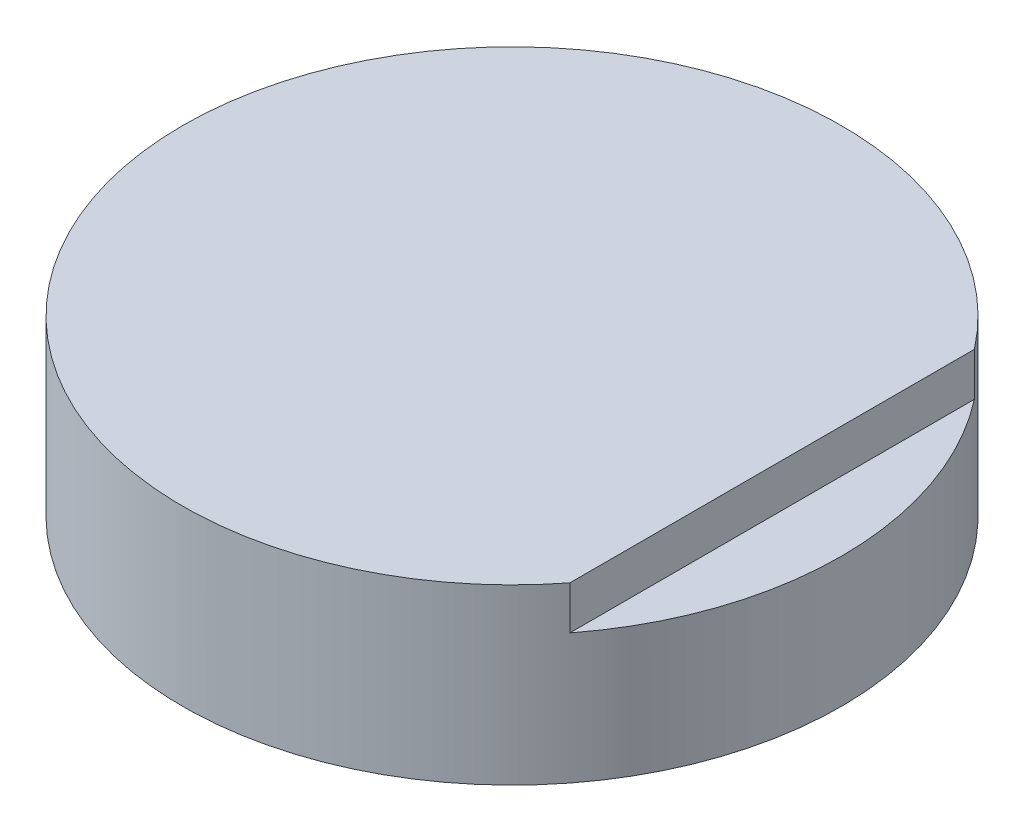
ISO-10303-21;
HEADER;
FILE_DESCRIPTION(('STEP AP214'),'2;1');
FILE_NAME('part.step','',(''),(''),'','','');
FILE_SCHEMA(('AUTOMOTIVE_DESIGN { 1 0 10303 214 1 1 1 1 }'));
ENDSEC;
DATA;
#1=APPLICATION_CONTEXT('core data for automotive mechanical design processes');
#2=APPLICATION_PROTOCOL_DEFINITION('international standard','automotive_design',2000,#1);
#3=PRODUCT_CONTEXT('',#1,'mechanical');
#4=PRODUCT('Part','Part','',(#3));
#5=PRODUCT_RELATED_PRODUCT_CATEGORY('part','',(#4));
#6=PRODUCT_DEFINITION_FORMATION('','',#4);
#7=PRODUCT_DEFINITION_CONTEXT('part definition',#1,'design');
#8=PRODUCT_DEFINITION('design','',#6,#7);
#9=PRODUCT_DEFINITION_SHAPE('','',#8);
#10=(LENGTH_UNIT() NAMED_UNIT(*) SI_UNIT(.MILLI.,.METRE.));
#11=(NAMED_UNIT(*) PLANE_ANGLE_UNIT() SI_UNIT($,.RADIAN.));
#12=(NAMED_UNIT(*) SI_UNIT($,.STERADIAN.) SOLID_ANGLE_UNIT());
#13=UNCERTAINTY_MEASURE_WITH_UNIT(LENGTH_MEASURE(1.E-05),#10,'distance_accuracy_value','');
#14=(GEOMETRIC_REPRESENTATION_CONTEXT(3) GLOBAL_UNCERTAINTY_ASSIGNED_CONTEXT((#13)) GLOBAL_UNIT_ASSIGNED_CONTEXT((#10,
#11,#12)) REPRESENTATION_CONTEXT('',''));
#15=CARTESIAN_POINT('',(0.,0.,0.));
#16=DIRECTION('',(0.,0.,1.));
#17=DIRECTION('',(1.,0.,0.));
#18=AXIS2_PLACEMENT_3D('',#15,#16,#17);
#19=CARTESIAN_POINT('',(-26.2916512459885,-69.5,0.));
#20=DIRECTION('',(0.,1.,0.));
#21=DIRECTION('',(0.,0.,1.));
#22=AXIS2_PLACEMENT_3D('',#19,#20,#21);
#23=CYLINDRICAL_SURFACE('',#22,3.8);
#24=CARTESIAN_POINT('',(-26.2916512459885,-69.,0.));
#25=DIRECTION('',(0.,-1.,0.));
#26=DIRECTION('',(0.,0.,-1.));
#27=AXIS2_PLACEMENT_3D('',#24,#25,#26);
#28=CIRCLE('',#27,3.8);
#29=CARTESIAN_POINT('',(-23.2916512459885,-69.,2.33238075793812));
#30=VERTEX_POINT('',#29);
#31=CARTESIAN_POINT('',(-23.2916512459885,-69.,-2.33238075793812));
#32=VERTEX_POINT('',#31);
#33=EDGE_CURVE('E82',#30,#32,#28,.T.);
#34=ORIENTED_EDGE('',*,*,#33,.T.);
#35=DIRECTION('',(0.,1.,0.));
#36=VECTOR('',#35,1.);
#37=CARTESIAN_POINT('',(-23.2916512459885,-69.5,-2.33238075793812));
#38=LINE('',#37,#36);
#39=CARTESIAN_POINT('',(-23.2916512459885,-69.5,-2.33238075793812));
#40=VERTEX_POINT('',#39);
#41=EDGE_CURVE('E11',#40,#32,#38,.T.);
#42=ORIENTED_EDGE('',*,*,#41,.F.);
#43=CARTESIAN_POINT('',(-26.2916512459885,-69.5,0.));
#44=DIRECTION('',(0.,-1.,0.));
#45=DIRECTION('',(0.,0.,-1.));
#46=AXIS2_PLACEMENT_3D('',#43,#44,#45);
#47=CIRCLE('',#46,3.8);
#48=CARTESIAN_POINT('',(-23.2916512459885,-69.5,2.33238075793812));
#49=VERTEX_POINT('',#48);
#50=EDGE_CURVE('E73',#40,#49,#47,.T.);
#51=ORIENTED_EDGE('',*,*,#50,.T.);
#52=DIRECTION('',(0.,1.,0.));
#53=VECTOR('',#52,1.);
#54=CARTESIAN_POINT('',(-23.2916512459885,-69.5,2.33238075793812));
#55=LINE('',#54,#53);
#56=EDGE_CURVE('E49',#49,#30,#55,.T.);
#57=ORIENTED_EDGE('',*,*,#56,.T.);
#58=EDGE_LOOP('',(#34,#42,#51,#57));
#59=FACE_BOUND('',#58,.T.);
#60=CARTESIAN_POINT('',(-26.2916512459885,-71.,0.));
#61=DIRECTION('',(0.,-1.,0.));
#62=DIRECTION('',(0.,0.,-1.));
#63=AXIS2_PLACEMENT_3D('',#60,#61,#62);
#64=CIRCLE('',#63,3.8);
#65=CARTESIAN_POINT('',(-26.2916512459885,-71.,-3.8));
#66=VERTEX_POINT('',#65);
#67=EDGE_CURVE('E79',#66,#66,#64,.T.);
#68=ORIENTED_EDGE('',*,*,#67,.F.);
#69=EDGE_LOOP('',(#68));
#70=FACE_BOUND('',#69,.T.);
#71=ADVANCED_FACE('F41',(#59,#70),#23,.T.);
#72=CARTESIAN_POINT('',(-23.2916512459885,-69.5,-2.33238075793812));
#73=DIRECTION('',(-1.,0.,0.));
#74=DIRECTION('',(0.,0.,1.));
#75=AXIS2_PLACEMENT_3D('',#72,#73,#74);
#76=PLANE('',#75);
#77=DIRECTION('',(0.,0.,1.));
#78=VECTOR('',#77,1.);
#79=CARTESIAN_POINT('',(-23.2916512459885,-69.,-2.33238075793812));
#80=LINE('',#79,#78);
#81=EDGE_CURVE('E65',#32,#30,#80,.T.);
#82=ORIENTED_EDGE('',*,*,#81,.T.);
#83=ORIENTED_EDGE('',*,*,#56,.F.);
#84=DIRECTION('',(0.,0.,1.));
#85=VECTOR('',#84,1.);
#86=CARTESIAN_POINT('',(-23.2916512459885,-69.5,-2.33238075793812));
#87=LINE('',#86,#85);
#88=EDGE_CURVE('E57',#40,#49,#87,.T.);
#89=ORIENTED_EDGE('',*,*,#88,.F.);
#90=ORIENTED_EDGE('',*,*,#41,.T.);
#91=EDGE_LOOP('',(#82,#83,#89,#90));
#92=FACE_BOUND('',#91,.T.);
#93=ADVANCED_FACE('F70',(#92),#76,.F.);
#94=CARTESIAN_POINT('',(-26.2916512459885,-69.,0.));
#95=DIRECTION('',(0.,-1.,0.));
#96=DIRECTION('',(0.,0.,-1.));
#97=AXIS2_PLACEMENT_3D('',#94,#95,#96);
#98=PLANE('',#97);
#99=ORIENTED_EDGE('',*,*,#33,.F.);
#100=ORIENTED_EDGE('',*,*,#81,.F.);
#101=EDGE_LOOP('',(#99,#100));
#102=FACE_BOUND('',#101,.T.);
#103=ADVANCED_FACE('F88',(#102),#98,.F.);
#104=CARTESIAN_POINT('',(-26.2916512459885,-69.5,0.));
#105=DIRECTION('',(0.,-1.,0.));
#106=DIRECTION('',(0.,0.,-1.));
#107=AXIS2_PLACEMENT_3D('',#104,#105,#106);
#108=PLANE('',#107);
#109=ORIENTED_EDGE('',*,*,#50,.F.);
#110=ORIENTED_EDGE('',*,*,#88,.T.);
#111=EDGE_LOOP('',(#109,#110));
#112=FACE_BOUND('',#111,.T.);
#113=ADVANCED_FACE('F74',(#112),#108,.F.);
#114=CARTESIAN_POINT('',(-26.2916512459885,-71.,0.));
#115=DIRECTION('',(0.,-1.,0.));
#116=DIRECTION('',(0.,0.,-1.));
#117=AXIS2_PLACEMENT_3D('',#114,#115,#116);
#118=PLANE('',#117);
#119=CARTESIAN_POINT('',(-26.2916512459885,-71.,0.));
#120=DIRECTION('',(0.,-1.,0.));
#121=DIRECTION('',(0.,0.,-1.));
#122=AXIS2_PLACEMENT_3D('',#119,#120,#121);
#123=CIRCLE('',#122,2.36854385646541);
#124=CARTESIAN_POINT('',(-26.2916512459885,-71.,-2.36854385646541));
#125=VERTEX_POINT('',#124);
#126=EDGE_CURVE('E42',#125,#125,#123,.T.);
#127=ORIENTED_EDGE('',*,*,#126,.F.);
#128=EDGE_LOOP('',(#127));
#129=FACE_BOUND('',#128,.T.);
#130=ORIENTED_EDGE('',*,*,#67,.T.);
#131=EDGE_LOOP('',(#130));
#132=FACE_BOUND('',#131,.T.);
#133=ADVANCED_FACE('F91',(#129,#132),#118,.T.);
#134=CARTESIAN_POINT('',(-26.2916512459885,-73.,0.));
#135=DIRECTION('',(0.,0.,-1.));
#136=DIRECTION('',(-1.,0.,0.));
#137=AXIS2_PLACEMENT_3D('',#134,#135,#136);
#138=SPHERICAL_SURFACE('',#137,3.1);
#139=CARTESIAN_POINT('',(-26.2916512459885,-73.,0.));
#140=DIRECTION('',(0.,-1.,0.));
#141=DIRECTION('',(0.,0.,-1.));
#142=AXIS2_PLACEMENT_3D('',#139,#140,#141);
#143=SPHERICAL_SURFACE('',#142,3.1);
#144=ORIENTED_EDGE('',*,*,#126,.T.);
#145=EDGE_LOOP('',(#144));
#146=FACE_BOUND('',#145,.T.);
#147=ADVANCED_FACE('F113',(#146),#143,.F.);
#148=CLOSED_SHELL('',(#71,#93,#103,#113,#133,#147));
#149=MANIFOLD_SOLID_BREP('B2',#148);
#150=ADVANCED_BREP_SHAPE_REPRESENTATION('',(#18,#149),#14);
#151=SHAPE_DEFINITION_REPRESENTATION(#9,#150);
ENDSEC;
END-ISO-10303-21;
